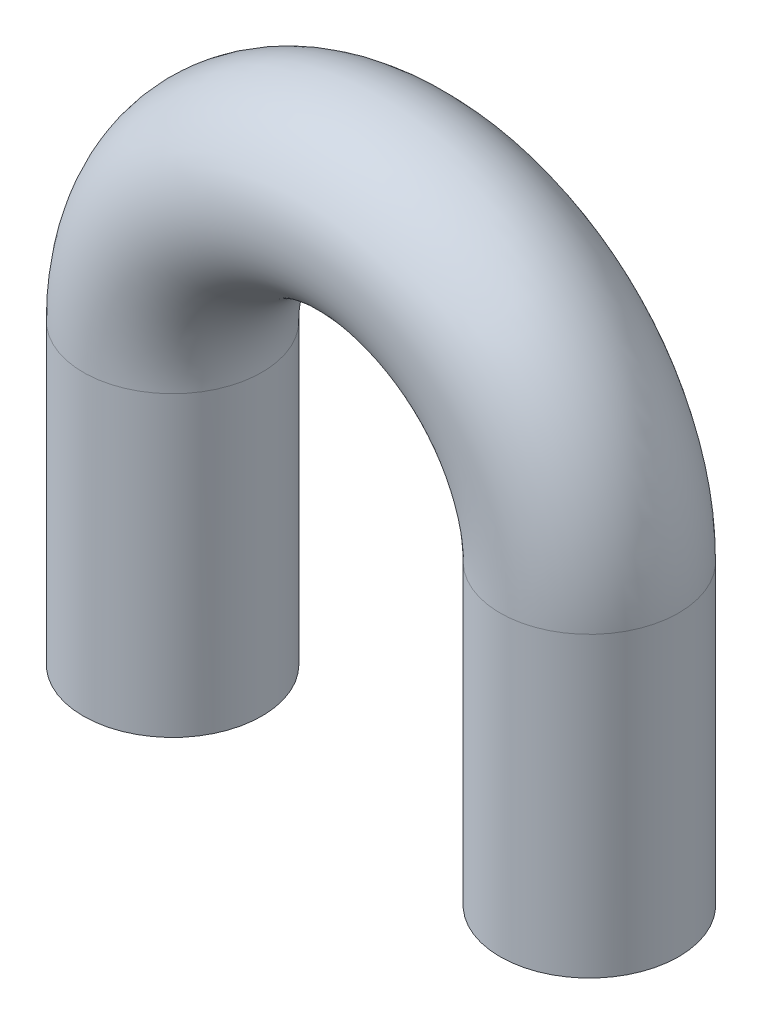
ISO-10303-21;
HEADER;
FILE_DESCRIPTION(('STEP AP214'),'2;1');
FILE_NAME('part.step','',(''),(''),'','','');
FILE_SCHEMA(('AUTOMOTIVE_DESIGN { 1 0 10303 214 1 1 1 1 }'));
ENDSEC;
DATA;
#1=APPLICATION_CONTEXT('core data for automotive mechanical design processes');
#2=APPLICATION_PROTOCOL_DEFINITION('international standard','automotive_design',2000,#1);
#3=PRODUCT_CONTEXT('',#1,'mechanical');
#4=PRODUCT('Part','Part','',(#3));
#5=PRODUCT_RELATED_PRODUCT_CATEGORY('part','',(#4));
#6=PRODUCT_DEFINITION_FORMATION('','',#4);
#7=PRODUCT_DEFINITION_CONTEXT('part definition',#1,'design');
#8=PRODUCT_DEFINITION('design','',#6,#7);
#9=PRODUCT_DEFINITION_SHAPE('','',#8);
#10=(LENGTH_UNIT() NAMED_UNIT(*) SI_UNIT(.MILLI.,.METRE.));
#11=(NAMED_UNIT(*) PLANE_ANGLE_UNIT() SI_UNIT($,.RADIAN.));
#12=(NAMED_UNIT(*) SI_UNIT($,.STERADIAN.) SOLID_ANGLE_UNIT());
#13=UNCERTAINTY_MEASURE_WITH_UNIT(LENGTH_MEASURE(1.E-05),#10,'distance_accuracy_value','');
#14=(GEOMETRIC_REPRESENTATION_CONTEXT(3) GLOBAL_UNCERTAINTY_ASSIGNED_CONTEXT((#13)) GLOBAL_UNIT_ASSIGNED_CONTEXT((#10,
#11,#12)) REPRESENTATION_CONTEXT('',''));
#15=CARTESIAN_POINT('',(0.,0.,0.));
#16=DIRECTION('',(0.,0.,1.));
#17=DIRECTION('',(1.,0.,0.));
#18=AXIS2_PLACEMENT_3D('',#15,#16,#17);
#19=CARTESIAN_POINT('',(-8.89,12.7,0.));
#20=DIRECTION('',(0.,-1.,0.));
#21=DIRECTION('',(0.,0.,-1.));
#22=AXIS2_PLACEMENT_3D('',#19,#20,#21);
#23=CYLINDRICAL_SURFACE('',#22,3.81);
#24=CARTESIAN_POINT('',(-8.89,12.7,0.));
#25=DIRECTION('',(0.,1.,0.));
#26=DIRECTION('',(0.,0.,1.));
#27=AXIS2_PLACEMENT_3D('',#24,#25,#26);
#28=CIRCLE('',#27,3.81);
#29=CARTESIAN_POINT('',(-12.7,12.7,0.));
#30=VERTEX_POINT('',#29);
#31=EDGE_CURVE('E10',#30,#30,#28,.T.);
#32=ORIENTED_EDGE('',*,*,#31,.F.);
#33=EDGE_LOOP('',(#32));
#34=FACE_BOUND('',#33,.T.);
#35=CARTESIAN_POINT('',(-8.89,0.,0.));
#36=DIRECTION('',(0.,1.,0.));
#37=DIRECTION('',(0.,0.,1.));
#38=AXIS2_PLACEMENT_3D('',#35,#36,#37);
#39=CIRCLE('',#38,3.81);
#40=CARTESIAN_POINT('',(-8.89,0.,3.81));
#41=VERTEX_POINT('',#40);
#42=EDGE_CURVE('E44',#41,#41,#39,.T.);
#43=ORIENTED_EDGE('',*,*,#42,.T.);
#44=EDGE_LOOP('',(#43));
#45=FACE_BOUND('',#44,.T.);
#46=ADVANCED_FACE('F41',(#34,#45),#23,.T.);
#47=CARTESIAN_POINT('',(-8.89,0.,0.));
#48=DIRECTION('',(0.,1.,0.));
#49=DIRECTION('',(0.,0.,1.));
#50=AXIS2_PLACEMENT_3D('',#47,#48,#49);
#51=PLANE('',#50);
#52=ORIENTED_EDGE('',*,*,#42,.F.);
#53=EDGE_LOOP('',(#52));
#54=FACE_BOUND('',#53,.T.);
#55=ADVANCED_FACE('F76',(#54),#51,.F.);
#56=CARTESIAN_POINT('',(0.,12.7,0.));
#57=DIRECTION('',(0.,0.,1.));
#58=DIRECTION('',(1.,0.,0.));
#59=AXIS2_PLACEMENT_3D('',#56,#57,#58);
#60=TOROIDAL_SURFACE('',#59,8.89,3.81);
#61=CARTESIAN_POINT('',(8.89,12.6999999999999,0.));
#62=DIRECTION('',(0.,-1.,0.));
#63=DIRECTION('',(0.,0.,1.));
#64=AXIS2_PLACEMENT_3D('',#61,#62,#63);
#65=CIRCLE('',#64,3.81);
#66=CARTESIAN_POINT('',(12.7,12.6999999999999,0.));
#67=VERTEX_POINT('',#66);
#68=EDGE_CURVE('E53',#67,#67,#65,.T.);
#69=CARTESIAN_POINT('',(0.,12.7,0.));
#70=DIRECTION('',(0.,0.,1.));
#71=DIRECTION('',(1.,0.,0.));
#72=AXIS2_PLACEMENT_3D('',#69,#70,#71);
#73=CIRCLE('',#72,12.7);
#74=EDGE_CURVE('',#67,#30,#73,.T.);
#75=ORIENTED_EDGE('',*,*,#68,.F.);
#76=ORIENTED_EDGE('',*,*,#31,.T.);
#77=ORIENTED_EDGE('',*,*,#74,.T.);
#78=ORIENTED_EDGE('',*,*,#74,.F.);
#79=EDGE_LOOP('',(#75,#77,#76,#78));
#80=FACE_BOUND('',#79,.T.);
#81=ADVANCED_FACE('F71',(#80),#60,.T.);
#82=CARTESIAN_POINT('',(8.89,12.7,0.));
#83=DIRECTION('',(0.,-1.,0.));
#84=DIRECTION('',(0.,0.,-1.));
#85=AXIS2_PLACEMENT_3D('',#82,#83,#84);
#86=CYLINDRICAL_SURFACE('',#85,3.81);
#87=ORIENTED_EDGE('',*,*,#68,.T.);
#88=EDGE_LOOP('',(#87));
#89=FACE_BOUND('',#88,.T.);
#90=CARTESIAN_POINT('',(8.89,0.,0.));
#91=DIRECTION('',(0.,1.,0.));
#92=DIRECTION('',(0.,0.,1.));
#93=AXIS2_PLACEMENT_3D('',#90,#91,#92);
#94=CIRCLE('',#93,3.81);
#95=CARTESIAN_POINT('',(8.89,0.,3.81));
#96=VERTEX_POINT('',#95);
#97=EDGE_CURVE('E58',#96,#96,#94,.T.);
#98=ORIENTED_EDGE('',*,*,#97,.T.);
#99=EDGE_LOOP('',(#98));
#100=FACE_BOUND('',#99,.T.);
#101=ADVANCED_FACE('F63',(#89,#100),#86,.T.);
#102=CARTESIAN_POINT('',(8.89,0.,0.));
#103=DIRECTION('',(0.,1.,0.));
#104=DIRECTION('',(0.,0.,1.));
#105=AXIS2_PLACEMENT_3D('',#102,#103,#104);
#106=PLANE('',#105);
#107=ORIENTED_EDGE('',*,*,#97,.F.);
#108=EDGE_LOOP('',(#107));
#109=FACE_BOUND('',#108,.T.);
#110=ADVANCED_FACE('F65',(#109),#106,.F.);
#111=CLOSED_SHELL('',(#46,#55,#81,#101,#110));
#112=MANIFOLD_SOLID_BREP('B2',#111);
#113=ADVANCED_BREP_SHAPE_REPRESENTATION('',(#18,#112),#14);
#114=SHAPE_DEFINITION_REPRESENTATION(#9,#113);
ENDSEC;
END-ISO-10303-21;
